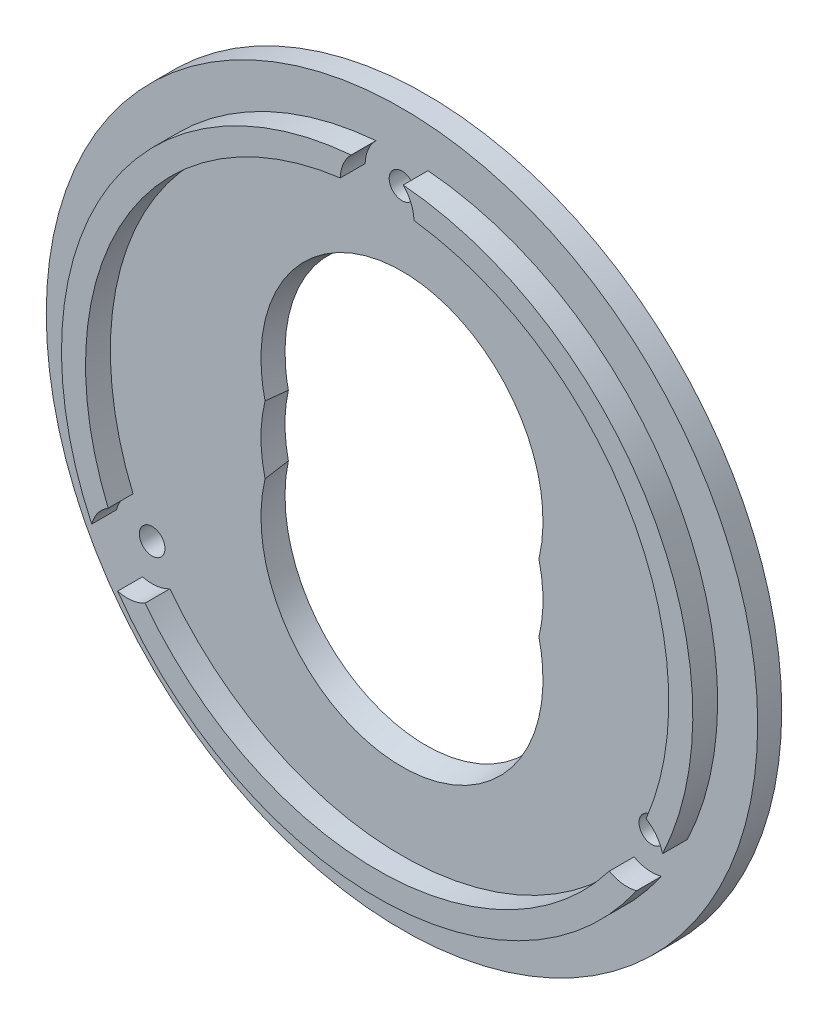
ISO-10303-21;
HEADER;
FILE_DESCRIPTION(('STEP AP214'),'2;1');
FILE_NAME('part.step','',(''),(''),'','','');
FILE_SCHEMA(('AUTOMOTIVE_DESIGN { 1 0 10303 214 1 1 1 1 }'));
ENDSEC;
DATA;
#1=APPLICATION_CONTEXT('core data for automotive mechanical design processes');
#2=APPLICATION_PROTOCOL_DEFINITION('international standard','automotive_design',2000,#1);
#3=PRODUCT_CONTEXT('',#1,'mechanical');
#4=PRODUCT('Part','Part','',(#3));
#5=PRODUCT_RELATED_PRODUCT_CATEGORY('part','',(#4));
#6=PRODUCT_DEFINITION_FORMATION('','',#4);
#7=PRODUCT_DEFINITION_CONTEXT('part definition',#1,'design');
#8=PRODUCT_DEFINITION('design','',#6,#7);
#9=PRODUCT_DEFINITION_SHAPE('','',#8);
#10=(LENGTH_UNIT() NAMED_UNIT(*) SI_UNIT(.MILLI.,.METRE.));
#11=(NAMED_UNIT(*) PLANE_ANGLE_UNIT() SI_UNIT($,.RADIAN.));
#12=(NAMED_UNIT(*) SI_UNIT($,.STERADIAN.) SOLID_ANGLE_UNIT());
#13=UNCERTAINTY_MEASURE_WITH_UNIT(LENGTH_MEASURE(1.E-05),#10,'distance_accuracy_value','');
#14=(GEOMETRIC_REPRESENTATION_CONTEXT(3) GLOBAL_UNCERTAINTY_ASSIGNED_CONTEXT((#13)) GLOBAL_UNIT_ASSIGNED_CONTEXT((#10,
#11,#12)) REPRESENTATION_CONTEXT('',''));
#15=CARTESIAN_POINT('',(0.,0.,0.));
#16=DIRECTION('',(0.,0.,1.));
#17=DIRECTION('',(1.,0.,0.));
#18=AXIS2_PLACEMENT_3D('',#15,#16,#17);
#19=CARTESIAN_POINT('',(0.,0.,6.1));
#20=DIRECTION('',(0.,0.,-1.));
#21=DIRECTION('',(-1.,0.,0.));
#22=AXIS2_PLACEMENT_3D('',#19,#20,#21);
#23=CYLINDRICAL_SURFACE('',#22,17.6);
#24=CARTESIAN_POINT('',(0.,0.,-28.977774788672));
#25=DIRECTION('',(0.,0.99144486137381,-0.130526192220052));
#26=DIRECTION('',(0.,-0.130526192220052,-0.99144486137381));
#27=AXIS2_PLACEMENT_3D('',#24,#25,#26);
#28=ELLIPSE('',#27,134.83883732951,17.6);
#29=CARTESIAN_POINT('',(17.1815541285931,3.81499642545375,0.));
#30=VERTEX_POINT('',#29);
#31=CARTESIAN_POINT('',(17.0890692551262,4.20995391821594,3.));
#32=VERTEX_POINT('',#31);
#33=EDGE_CURVE('E147',#30,#32,#28,.F.);
#34=ORIENTED_EDGE('',*,*,#33,.F.);
#35=CARTESIAN_POINT('',(0.,0.,0.));
#36=DIRECTION('',(0.,0.,1.));
#37=DIRECTION('',(1.,0.,0.));
#38=AXIS2_PLACEMENT_3D('',#35,#36,#37);
#39=CIRCLE('',#38,17.6);
#40=CARTESIAN_POINT('',(17.1815541285931,-3.81499642545375,0.));
#41=VERTEX_POINT('',#40);
#42=EDGE_CURVE('E156',#30,#41,#39,.F.);
#43=ORIENTED_EDGE('',*,*,#42,.T.);
#44=CARTESIAN_POINT('',(0.,0.,-28.977774788672));
#45=DIRECTION('',(0.,-0.99144486137381,-0.130526192220052));
#46=DIRECTION('',(0.,0.130526192220052,-0.99144486137381));
#47=AXIS2_PLACEMENT_3D('',#44,#45,#46);
#48=ELLIPSE('',#47,134.83883732951,17.6);
#49=CARTESIAN_POINT('',(17.0890692551262,-4.20995391821594,3.));
#50=VERTEX_POINT('',#49);
#51=EDGE_CURVE('E43',#41,#50,#48,.T.);
#52=ORIENTED_EDGE('',*,*,#51,.T.);
#53=CARTESIAN_POINT('',(0.,0.,3.));
#54=DIRECTION('',(0.,0.,1.));
#55=DIRECTION('',(1.,0.,0.));
#56=AXIS2_PLACEMENT_3D('',#53,#54,#55);
#57=CIRCLE('',#56,17.6);
#58=EDGE_CURVE('E157',#32,#50,#57,.F.);
#59=ORIENTED_EDGE('',*,*,#58,.F.);
#60=EDGE_LOOP('',(#34,#43,#52,#59));
#61=FACE_BOUND('',#60,.T.);
#62=ADVANCED_FACE('F35',(#61),#23,.F.);
#63=CARTESIAN_POINT('',(-17.0890692551262,4.20995391821594,3.));
#64=VERTEX_POINT('',#63);
#65=CARTESIAN_POINT('',(-17.1815541285931,3.81499642545375,0.));
#66=VERTEX_POINT('',#65);
#67=EDGE_CURVE('E50',#64,#66,#28,.F.);
#68=ORIENTED_EDGE('',*,*,#67,.F.);
#69=CARTESIAN_POINT('',(-17.0890692551262,-4.20995391821594,3.));
#70=VERTEX_POINT('',#69);
#71=EDGE_CURVE('E277',#70,#64,#57,.F.);
#72=ORIENTED_EDGE('',*,*,#71,.F.);
#73=CARTESIAN_POINT('',(-17.1815541285931,-3.81499642545375,0.));
#74=VERTEX_POINT('',#73);
#75=EDGE_CURVE('E170',#70,#74,#48,.T.);
#76=ORIENTED_EDGE('',*,*,#75,.T.);
#77=EDGE_CURVE('E162',#74,#66,#39,.F.);
#78=ORIENTED_EDGE('',*,*,#77,.T.);
#79=EDGE_LOOP('',(#68,#72,#76,#78));
#80=FACE_BOUND('',#79,.T.);
#81=ADVANCED_FACE('F289',(#80),#23,.F.);
#82=CARTESIAN_POINT('',(0.,0.,3.));
#83=DIRECTION('',(0.,0.,1.));
#84=DIRECTION('',(1.,0.,0.));
#85=AXIS2_PLACEMENT_3D('',#82,#83,#84);
#86=PLANE('',#85);
#87=CARTESIAN_POINT('',(0.,8.56841893036899,3.));
#88=DIRECTION('',(0.,0.,1.));
#89=DIRECTION('',(0.,-1.,0.));
#90=AXIS2_PLACEMENT_3D('',#87,#88,#89);
#91=ELLIPSE('',#90,18.2208607752175,17.6);
#92=EDGE_CURVE('E158',#32,#64,#91,.T.);
#93=ORIENTED_EDGE('',*,*,#92,.F.);
#94=ORIENTED_EDGE('',*,*,#58,.T.);
#95=CARTESIAN_POINT('',(0.,-8.56841893036899,3.));
#96=DIRECTION('',(0.,0.,1.));
#97=DIRECTION('',(0.,1.,0.));
#98=AXIS2_PLACEMENT_3D('',#95,#96,#97);
#99=ELLIPSE('',#98,18.2208607752175,17.6);
#100=EDGE_CURVE('E163',#50,#70,#99,.F.);
#101=ORIENTED_EDGE('',*,*,#100,.T.);
#102=ORIENTED_EDGE('',*,*,#71,.T.);
#103=EDGE_LOOP('',(#93,#94,#101,#102));
#104=FACE_BOUND('',#103,.T.);
#105=CARTESIAN_POINT('',(0.,0.,3.));
#106=DIRECTION('',(0.,0.,-1.));
#107=DIRECTION('',(1.,0.,0.));
#108=AXIS2_PLACEMENT_3D('',#105,#106,#107);
#109=CIRCLE('',#108,36.395);
#110=CARTESIAN_POINT('',(28.9669357832984,-22.0343517337421,3.));
#111=VERTEX_POINT('',#110);
#112=CARTESIAN_POINT('',(-28.9669357832984,-22.0343517337421,3.));
#113=VERTEX_POINT('',#112);
#114=EDGE_CURVE('E272',#111,#113,#109,.T.);
#115=ORIENTED_EDGE('',*,*,#114,.F.);
#116=CARTESIAN_POINT('',(31.1769145362398,-18.,3.));
#117=DIRECTION('',(0.,0.,-1.));
#118=DIRECTION('',(1.,0.,0.));
#119=AXIS2_PLACEMENT_3D('',#116,#117,#118);
#120=CIRCLE('',#119,4.60000000000003);
#121=CARTESIAN_POINT('',(32.379109419655,-22.4401269646589,3.));
#122=VERTEX_POINT('',#121);
#123=EDGE_CURVE('E274',#122,#111,#120,.T.);
#124=ORIENTED_EDGE('',*,*,#123,.F.);
#125=CARTESIAN_POINT('',(0.,0.,3.));
#126=DIRECTION('',(0.,0.,1.));
#127=DIRECTION('',(1.,0.,0.));
#128=AXIS2_PLACEMENT_3D('',#125,#126,#127);
#129=CIRCLE('',#128,39.395);
#130=CARTESIAN_POINT('',(-32.379109419655,-22.4401269646588,3.));
#131=VERTEX_POINT('',#130);
#132=EDGE_CURVE('E266',#131,#122,#129,.T.);
#133=ORIENTED_EDGE('',*,*,#132,.F.);
#134=CARTESIAN_POINT('',(-31.1769145362398,-18.,3.));
#135=DIRECTION('',(0.,0.,-1.));
#136=DIRECTION('',(1.,0.,0.));
#137=AXIS2_PLACEMENT_3D('',#134,#135,#136);
#138=CIRCLE('',#137,4.60000000000003);
#139=EDGE_CURVE('E269',#113,#131,#138,.T.);
#140=ORIENTED_EDGE('',*,*,#139,.F.);
#141=EDGE_LOOP('',(#115,#124,#133,#140));
#142=FACE_BOUND('',#141,.T.);
#143=CARTESIAN_POINT('',(31.1769145362398,-18.,3.));
#144=DIRECTION('',(0.,0.,1.));
#145=DIRECTION('',(1.,0.,0.));
#146=AXIS2_PLACEMENT_3D('',#143,#144,#145);
#147=CIRCLE('',#146,1.6);
#148=CARTESIAN_POINT('',(32.7769145362398,-18.,3.));
#149=VERTEX_POINT('',#148);
#150=EDGE_CURVE('E183',#149,#149,#147,.T.);
#151=ORIENTED_EDGE('',*,*,#150,.F.);
#152=EDGE_LOOP('',(#151));
#153=FACE_BOUND('',#152,.T.);
#154=CARTESIAN_POINT('',(0.,0.,3.));
#155=DIRECTION('',(0.,0.,1.));
#156=DIRECTION('',(1.,0.,0.));
#157=AXIS2_PLACEMENT_3D('',#154,#155,#156);
#158=CIRCLE('',#157,44.395);
#159=CARTESIAN_POINT('',(44.395,0.,3.));
#160=VERTEX_POINT('',#159);
#161=EDGE_CURVE('E171',#160,#160,#158,.T.);
#162=ORIENTED_EDGE('',*,*,#161,.T.);
#163=EDGE_LOOP('',(#162));
#164=FACE_BOUND('',#163,.T.);
#165=CARTESIAN_POINT('',(0.,36.,3.));
#166=DIRECTION('',(0.,0.,1.));
#167=DIRECTION('',(1.,0.,0.));
#168=AXIS2_PLACEMENT_3D('',#165,#166,#167);
#169=CIRCLE('',#168,1.6);
#170=CARTESIAN_POINT('',(1.6,36.,3.));
#171=VERTEX_POINT('',#170);
#172=EDGE_CURVE('E178',#171,#171,#169,.T.);
#173=ORIENTED_EDGE('',*,*,#172,.F.);
#174=EDGE_LOOP('',(#173));
#175=FACE_BOUND('',#174,.T.);
#176=CARTESIAN_POINT('',(-31.1769145362398,-18.,3.));
#177=DIRECTION('',(0.,0.,1.));
#178=DIRECTION('',(1.,0.,0.));
#179=AXIS2_PLACEMENT_3D('',#176,#177,#178);
#180=CIRCLE('',#179,1.6);
#181=CARTESIAN_POINT('',(-29.5769145362398,-18.,3.));
#182=VERTEX_POINT('',#181);
#183=EDGE_CURVE('E189',#182,#182,#180,.T.);
#184=ORIENTED_EDGE('',*,*,#183,.F.);
#185=EDGE_LOOP('',(#184));
#186=FACE_BOUND('',#185,.T.);
#187=CARTESIAN_POINT('',(0.,36.,3.));
#188=DIRECTION('',(0.,0.,-1.));
#189=DIRECTION('',(1.,0.,0.));
#190=AXIS2_PLACEMENT_3D('',#187,#188,#189);
#191=CIRCLE('',#190,4.60000000000003);
#192=CARTESIAN_POINT('',(3.24416530571525,39.2611947916667,3.));
#193=VERTEX_POINT('',#192);
#194=CARTESIAN_POINT('',(4.59884046569315,36.103278125,3.));
#195=VERTEX_POINT('',#194);
#196=EDGE_CURVE('E214',#193,#195,#191,.T.);
#197=ORIENTED_EDGE('',*,*,#196,.F.);
#198=CARTESIAN_POINT('',(0.,0.,3.));
#199=DIRECTION('',(0.,0.,1.));
#200=DIRECTION('',(1.,0.,0.));
#201=AXIS2_PLACEMENT_3D('',#198,#199,#200);
#202=CIRCLE('',#201,39.395);
#203=CARTESIAN_POINT('',(35.6232747253702,-16.8210678270078,3.));
#204=VERTEX_POINT('',#203);
#205=EDGE_CURVE('E216',#204,#193,#202,.T.);
#206=ORIENTED_EDGE('',*,*,#205,.F.);
#207=CARTESIAN_POINT('',(31.1769145362398,-18.,3.));
#208=DIRECTION('',(0.,0.,-1.));
#209=DIRECTION('',(1.,0.,0.));
#210=AXIS2_PLACEMENT_3D('',#207,#208,#209);
#211=CIRCLE('',#210,4.60000000000003);
#212=CARTESIAN_POINT('',(33.5657762489916,-14.0689263912579,3.));
#213=VERTEX_POINT('',#212);
#214=EDGE_CURVE('E208',#213,#204,#211,.T.);
#215=ORIENTED_EDGE('',*,*,#214,.F.);
#216=CARTESIAN_POINT('',(0.,0.,3.));
#217=DIRECTION('',(0.,0.,-1.));
#218=DIRECTION('',(1.,0.,0.));
#219=AXIS2_PLACEMENT_3D('',#216,#217,#218);
#220=CIRCLE('',#219,36.395);
#221=EDGE_CURVE('E211',#195,#213,#220,.T.);
#222=ORIENTED_EDGE('',*,*,#221,.F.);
#223=EDGE_LOOP('',(#197,#206,#215,#222));
#224=FACE_BOUND('',#223,.T.);
#225=CARTESIAN_POINT('',(0.,0.,3.));
#226=DIRECTION('',(0.,0.,1.));
#227=DIRECTION('',(1.,0.,0.));
#228=AXIS2_PLACEMENT_3D('',#225,#226,#227);
#229=CIRCLE('',#228,39.395);
#230=CARTESIAN_POINT('',(-3.24416530571525,39.2611947916667,3.));
#231=VERTEX_POINT('',#230);
#232=CARTESIAN_POINT('',(-35.6232747253703,-16.8210678270078,3.));
#233=VERTEX_POINT('',#232);
#234=EDGE_CURVE('E243',#231,#233,#229,.T.);
#235=ORIENTED_EDGE('',*,*,#234,.F.);
#236=CARTESIAN_POINT('',(0.,36.,3.));
#237=DIRECTION('',(0.,0.,-1.));
#238=DIRECTION('',(1.,0.,0.));
#239=AXIS2_PLACEMENT_3D('',#236,#237,#238);
#240=CIRCLE('',#239,4.60000000000003);
#241=CARTESIAN_POINT('',(-4.59884046569315,36.103278125,3.));
#242=VERTEX_POINT('',#241);
#243=EDGE_CURVE('E245',#242,#231,#240,.T.);
#244=ORIENTED_EDGE('',*,*,#243,.F.);
#245=CARTESIAN_POINT('',(0.,0.,3.));
#246=DIRECTION('',(0.,0.,-1.));
#247=DIRECTION('',(1.,0.,0.));
#248=AXIS2_PLACEMENT_3D('',#245,#246,#247);
#249=CIRCLE('',#248,36.395);
#250=CARTESIAN_POINT('',(-33.5657762489916,-14.0689263912579,3.));
#251=VERTEX_POINT('',#250);
#252=EDGE_CURVE('E237',#251,#242,#249,.T.);
#253=ORIENTED_EDGE('',*,*,#252,.F.);
#254=CARTESIAN_POINT('',(-31.1769145362398,-18.,3.));
#255=DIRECTION('',(0.,0.,-1.));
#256=DIRECTION('',(1.,0.,0.));
#257=AXIS2_PLACEMENT_3D('',#254,#255,#256);
#258=CIRCLE('',#257,4.60000000000003);
#259=EDGE_CURVE('E240',#233,#251,#258,.T.);
#260=ORIENTED_EDGE('',*,*,#259,.F.);
#261=EDGE_LOOP('',(#235,#244,#253,#260));
#262=FACE_BOUND('',#261,.T.);
#263=ADVANCED_FACE('F290',(#104,#142,#153,#164,#175,#186,#224,#262),#86,.T.);
#264=CARTESIAN_POINT('',(0.,0.,0.));
#265=DIRECTION('',(0.,0.,1.));
#266=DIRECTION('',(1.,0.,0.));
#267=AXIS2_PLACEMENT_3D('',#264,#265,#266);
#268=PLANE('',#267);
#269=ORIENTED_EDGE('',*,*,#42,.F.);
#270=CARTESIAN_POINT('',(0.,7.76457135307562,0.));
#271=DIRECTION('',(0.,0.,1.));
#272=DIRECTION('',(0.,-1.,0.));
#273=AXIS2_PLACEMENT_3D('',#270,#271,#272);
#274=ELLIPSE('',#273,18.2208607752175,17.6);
#275=EDGE_CURVE('E11',#30,#66,#274,.T.);
#276=ORIENTED_EDGE('',*,*,#275,.T.);
#277=ORIENTED_EDGE('',*,*,#77,.F.);
#278=CARTESIAN_POINT('',(0.,-7.76457135307562,0.));
#279=DIRECTION('',(0.,0.,1.));
#280=DIRECTION('',(0.,1.,0.));
#281=AXIS2_PLACEMENT_3D('',#278,#279,#280);
#282=ELLIPSE('',#281,18.2208607752175,17.6);
#283=EDGE_CURVE('E57',#41,#74,#282,.F.);
#284=ORIENTED_EDGE('',*,*,#283,.F.);
#285=EDGE_LOOP('',(#269,#276,#277,#284));
#286=FACE_BOUND('',#285,.T.);
#287=CARTESIAN_POINT('',(0.,0.,0.));
#288=DIRECTION('',(0.,0.,1.));
#289=DIRECTION('',(1.,0.,0.));
#290=AXIS2_PLACEMENT_3D('',#287,#288,#289);
#291=CIRCLE('',#290,44.395);
#292=CARTESIAN_POINT('',(44.395,0.,0.));
#293=VERTEX_POINT('',#292);
#294=EDGE_CURVE('E168',#293,#293,#291,.T.);
#295=ORIENTED_EDGE('',*,*,#294,.F.);
#296=EDGE_LOOP('',(#295));
#297=FACE_BOUND('',#296,.T.);
#298=CARTESIAN_POINT('',(0.,36.,0.));
#299=DIRECTION('',(0.,0.,1.));
#300=DIRECTION('',(1.,0.,0.));
#301=AXIS2_PLACEMENT_3D('',#298,#299,#300);
#302=CIRCLE('',#301,1.6);
#303=CARTESIAN_POINT('',(1.6,36.,0.));
#304=VERTEX_POINT('',#303);
#305=EDGE_CURVE('E180',#304,#304,#302,.T.);
#306=ORIENTED_EDGE('',*,*,#305,.T.);
#307=EDGE_LOOP('',(#306));
#308=FACE_BOUND('',#307,.T.);
#309=CARTESIAN_POINT('',(31.1769145362398,-18.,0.));
#310=DIRECTION('',(0.,0.,1.));
#311=DIRECTION('',(1.,0.,0.));
#312=AXIS2_PLACEMENT_3D('',#309,#310,#311);
#313=CIRCLE('',#312,1.6);
#314=CARTESIAN_POINT('',(32.7769145362398,-18.,0.));
#315=VERTEX_POINT('',#314);
#316=EDGE_CURVE('E186',#315,#315,#313,.T.);
#317=ORIENTED_EDGE('',*,*,#316,.T.);
#318=EDGE_LOOP('',(#317));
#319=FACE_BOUND('',#318,.T.);
#320=CARTESIAN_POINT('',(-31.1769145362398,-18.,0.));
#321=DIRECTION('',(0.,0.,1.));
#322=DIRECTION('',(1.,0.,0.));
#323=AXIS2_PLACEMENT_3D('',#320,#321,#322);
#324=CIRCLE('',#323,1.6);
#325=CARTESIAN_POINT('',(-29.5769145362398,-18.,0.));
#326=VERTEX_POINT('',#325);
#327=EDGE_CURVE('E192',#326,#326,#324,.T.);
#328=ORIENTED_EDGE('',*,*,#327,.T.);
#329=EDGE_LOOP('',(#328));
#330=FACE_BOUND('',#329,.T.);
#331=ADVANCED_FACE('F160',(#286,#297,#308,#319,#330),#268,.F.);
#332=CARTESIAN_POINT('',(0.,0.,3.));
#333=DIRECTION('',(0.,0.,-1.));
#334=DIRECTION('',(-1.,0.,0.));
#335=AXIS2_PLACEMENT_3D('',#332,#333,#334);
#336=CYLINDRICAL_SURFACE('',#335,44.395);
#337=ORIENTED_EDGE('',*,*,#161,.F.);
#338=EDGE_LOOP('',(#337));
#339=FACE_BOUND('',#338,.T.);
#340=ORIENTED_EDGE('',*,*,#294,.T.);
#341=EDGE_LOOP('',(#340));
#342=FACE_BOUND('',#341,.T.);
#343=ADVANCED_FACE('F37',(#339,#342),#336,.T.);
#344=CARTESIAN_POINT('',(0.,36.,3.));
#345=DIRECTION('',(0.,0.,-1.));
#346=DIRECTION('',(-1.,0.,0.));
#347=AXIS2_PLACEMENT_3D('',#344,#345,#346);
#348=CYLINDRICAL_SURFACE('',#347,1.6);
#349=ORIENTED_EDGE('',*,*,#172,.T.);
#350=EDGE_LOOP('',(#349));
#351=FACE_BOUND('',#350,.T.);
#352=ORIENTED_EDGE('',*,*,#305,.F.);
#353=EDGE_LOOP('',(#352));
#354=FACE_BOUND('',#353,.T.);
#355=ADVANCED_FACE('F375',(#351,#354),#348,.F.);
#356=CARTESIAN_POINT('',(31.1769145362398,-18.,3.));
#357=DIRECTION('',(0.,0.,-1.));
#358=DIRECTION('',(-1.,0.,0.));
#359=AXIS2_PLACEMENT_3D('',#356,#357,#358);
#360=CYLINDRICAL_SURFACE('',#359,1.6);
#361=ORIENTED_EDGE('',*,*,#150,.T.);
#362=EDGE_LOOP('',(#361));
#363=FACE_BOUND('',#362,.T.);
#364=ORIENTED_EDGE('',*,*,#316,.F.);
#365=EDGE_LOOP('',(#364));
#366=FACE_BOUND('',#365,.T.);
#367=ADVANCED_FACE('F371',(#363,#366),#360,.F.);
#368=CARTESIAN_POINT('',(-31.1769145362398,-18.,3.));
#369=DIRECTION('',(0.,0.,-1.));
#370=DIRECTION('',(-1.,0.,0.));
#371=AXIS2_PLACEMENT_3D('',#368,#369,#370);
#372=CYLINDRICAL_SURFACE('',#371,1.6);
#373=ORIENTED_EDGE('',*,*,#183,.T.);
#374=EDGE_LOOP('',(#373));
#375=FACE_BOUND('',#374,.T.);
#376=ORIENTED_EDGE('',*,*,#327,.F.);
#377=EDGE_LOOP('',(#376));
#378=FACE_BOUND('',#377,.T.);
#379=ADVANCED_FACE('F367',(#375,#378),#372,.F.);
#380=CARTESIAN_POINT('',(0.,0.,6.1));
#381=DIRECTION('',(0.,0.,-1.));
#382=DIRECTION('',(-1.,0.,0.));
#383=AXIS2_PLACEMENT_3D('',#380,#381,#382);
#384=CYLINDRICAL_SURFACE('',#383,39.395);
#385=ORIENTED_EDGE('',*,*,#205,.T.);
#386=DIRECTION('',(0.,0.,-1.));
#387=VECTOR('',#386,1.);
#388=CARTESIAN_POINT('',(3.24416530571525,39.2611947916667,6.1));
#389=LINE('',#388,#387);
#390=CARTESIAN_POINT('',(3.24416530571525,39.2611947916667,6.1));
#391=VERTEX_POINT('',#390);
#392=EDGE_CURVE('E195',#391,#193,#389,.T.);
#393=ORIENTED_EDGE('',*,*,#392,.F.);
#394=CARTESIAN_POINT('',(0.,0.,6.1));
#395=DIRECTION('',(0.,0.,1.));
#396=DIRECTION('',(1.,0.,0.));
#397=AXIS2_PLACEMENT_3D('',#394,#395,#396);
#398=CIRCLE('',#397,39.395);
#399=CARTESIAN_POINT('',(35.6232747253702,-16.8210678270078,6.1));
#400=VERTEX_POINT('',#399);
#401=EDGE_CURVE('E210',#400,#391,#398,.T.);
#402=ORIENTED_EDGE('',*,*,#401,.F.);
#403=DIRECTION('',(0.,0.,-1.));
#404=VECTOR('',#403,1.);
#405=CARTESIAN_POINT('',(35.6232747253702,-16.8210678270078,6.1));
#406=LINE('',#405,#404);
#407=EDGE_CURVE('E204',#400,#204,#406,.T.);
#408=ORIENTED_EDGE('',*,*,#407,.T.);
#409=EDGE_LOOP('',(#385,#393,#402,#408));
#410=FACE_BOUND('',#409,.T.);
#411=ADVANCED_FACE('F363',(#410),#384,.T.);
#412=CARTESIAN_POINT('',(0.,36.,6.1));
#413=DIRECTION('',(0.,0.,-1.));
#414=DIRECTION('',(-1.,0.,0.));
#415=AXIS2_PLACEMENT_3D('',#412,#413,#414);
#416=CYLINDRICAL_SURFACE('',#415,4.60000000000003);
#417=ORIENTED_EDGE('',*,*,#196,.T.);
#418=DIRECTION('',(0.,0.,-1.));
#419=VECTOR('',#418,1.);
#420=CARTESIAN_POINT('',(4.59884046569315,36.103278125,6.1));
#421=LINE('',#420,#419);
#422=CARTESIAN_POINT('',(4.59884046569315,36.103278125,6.1));
#423=VERTEX_POINT('',#422);
#424=EDGE_CURVE('E199',#423,#195,#421,.T.);
#425=ORIENTED_EDGE('',*,*,#424,.F.);
#426=CARTESIAN_POINT('',(0.,36.,6.1));
#427=DIRECTION('',(0.,0.,-1.));
#428=DIRECTION('',(1.,0.,0.));
#429=AXIS2_PLACEMENT_3D('',#426,#427,#428);
#430=CIRCLE('',#429,4.60000000000003);
#431=EDGE_CURVE('E223',#391,#423,#430,.T.);
#432=ORIENTED_EDGE('',*,*,#431,.F.);
#433=ORIENTED_EDGE('',*,*,#392,.T.);
#434=EDGE_LOOP('',(#417,#425,#432,#433));
#435=FACE_BOUND('',#434,.T.);
#436=ADVANCED_FACE('F359',(#435),#416,.F.);
#437=CARTESIAN_POINT('',(0.,0.,6.1));
#438=DIRECTION('',(0.,0.,-1.));
#439=DIRECTION('',(-1.,0.,0.));
#440=AXIS2_PLACEMENT_3D('',#437,#438,#439);
#441=CYLINDRICAL_SURFACE('',#440,36.395);
#442=ORIENTED_EDGE('',*,*,#221,.T.);
#443=DIRECTION('',(0.,0.,-1.));
#444=VECTOR('',#443,1.);
#445=CARTESIAN_POINT('',(33.5657762489916,-14.0689263912579,6.1));
#446=LINE('',#445,#444);
#447=CARTESIAN_POINT('',(33.5657762489916,-14.0689263912579,6.1));
#448=VERTEX_POINT('',#447);
#449=EDGE_CURVE('E202',#448,#213,#446,.T.);
#450=ORIENTED_EDGE('',*,*,#449,.F.);
#451=CARTESIAN_POINT('',(0.,0.,6.1));
#452=DIRECTION('',(0.,0.,-1.));
#453=DIRECTION('',(1.,0.,0.));
#454=AXIS2_PLACEMENT_3D('',#451,#452,#453);
#455=CIRCLE('',#454,36.395);
#456=EDGE_CURVE('E221',#423,#448,#455,.T.);
#457=ORIENTED_EDGE('',*,*,#456,.F.);
#458=ORIENTED_EDGE('',*,*,#424,.T.);
#459=EDGE_LOOP('',(#442,#450,#457,#458));
#460=FACE_BOUND('',#459,.T.);
#461=ADVANCED_FACE('F355',(#460),#441,.F.);
#462=CARTESIAN_POINT('',(31.1769145362398,-18.,6.1));
#463=DIRECTION('',(0.,0.,-1.));
#464=DIRECTION('',(-1.,0.,0.));
#465=AXIS2_PLACEMENT_3D('',#462,#463,#464);
#466=CYLINDRICAL_SURFACE('',#465,4.60000000000003);
#467=ORIENTED_EDGE('',*,*,#214,.T.);
#468=ORIENTED_EDGE('',*,*,#407,.F.);
#469=CARTESIAN_POINT('',(31.1769145362398,-18.,6.1));
#470=DIRECTION('',(0.,0.,-1.));
#471=DIRECTION('',(1.,0.,0.));
#472=AXIS2_PLACEMENT_3D('',#469,#470,#471);
#473=CIRCLE('',#472,4.60000000000003);
#474=EDGE_CURVE('E207',#448,#400,#473,.T.);
#475=ORIENTED_EDGE('',*,*,#474,.F.);
#476=ORIENTED_EDGE('',*,*,#449,.T.);
#477=EDGE_LOOP('',(#467,#468,#475,#476));
#478=FACE_BOUND('',#477,.T.);
#479=ADVANCED_FACE('F351',(#478),#466,.F.);
#480=CARTESIAN_POINT('',(0.,18.,6.1));
#481=DIRECTION('',(0.,0.,1.));
#482=DIRECTION('',(1.,0.,0.));
#483=AXIS2_PLACEMENT_3D('',#480,#481,#482);
#484=PLANE('',#483);
#485=ORIENTED_EDGE('',*,*,#401,.T.);
#486=ORIENTED_EDGE('',*,*,#431,.T.);
#487=ORIENTED_EDGE('',*,*,#456,.T.);
#488=ORIENTED_EDGE('',*,*,#474,.T.);
#489=EDGE_LOOP('',(#485,#486,#487,#488));
#490=FACE_BOUND('',#489,.T.);
#491=ADVANCED_FACE('F347',(#490),#484,.T.);
#492=CARTESIAN_POINT('',(0.,36.,6.1));
#493=DIRECTION('',(0.,0.,-1.));
#494=DIRECTION('',(-1.,0.,0.));
#495=AXIS2_PLACEMENT_3D('',#492,#493,#494);
#496=CYLINDRICAL_SURFACE('',#495,4.60000000000003);
#497=ORIENTED_EDGE('',*,*,#243,.T.);
#498=DIRECTION('',(0.,0.,-1.));
#499=VECTOR('',#498,1.);
#500=CARTESIAN_POINT('',(-3.24416530571525,39.2611947916667,6.1));
#501=LINE('',#500,#499);
#502=CARTESIAN_POINT('',(-3.24416530571525,39.2611947916667,6.1));
#503=VERTEX_POINT('',#502);
#504=EDGE_CURVE('E219',#503,#231,#501,.T.);
#505=ORIENTED_EDGE('',*,*,#504,.F.);
#506=CARTESIAN_POINT('',(0.,36.,6.1));
#507=DIRECTION('',(0.,0.,-1.));
#508=DIRECTION('',(1.,0.,0.));
#509=AXIS2_PLACEMENT_3D('',#506,#507,#508);
#510=CIRCLE('',#509,4.60000000000003);
#511=CARTESIAN_POINT('',(-4.59884046569315,36.103278125,6.1));
#512=VERTEX_POINT('',#511);
#513=EDGE_CURVE('E239',#512,#503,#510,.T.);
#514=ORIENTED_EDGE('',*,*,#513,.F.);
#515=DIRECTION('',(0.,0.,-1.));
#516=VECTOR('',#515,1.);
#517=CARTESIAN_POINT('',(-4.59884046569315,36.103278125,6.1));
#518=LINE('',#517,#516);
#519=EDGE_CURVE('E233',#512,#242,#518,.T.);
#520=ORIENTED_EDGE('',*,*,#519,.T.);
#521=EDGE_LOOP('',(#497,#505,#514,#520));
#522=FACE_BOUND('',#521,.T.);
#523=ADVANCED_FACE('F343',(#522),#496,.F.);
#524=CARTESIAN_POINT('',(0.,0.,6.1));
#525=DIRECTION('',(0.,0.,-1.));
#526=DIRECTION('',(-1.,0.,0.));
#527=AXIS2_PLACEMENT_3D('',#524,#525,#526);
#528=CYLINDRICAL_SURFACE('',#527,39.395);
#529=ORIENTED_EDGE('',*,*,#234,.T.);
#530=DIRECTION('',(0.,0.,-1.));
#531=VECTOR('',#530,1.);
#532=CARTESIAN_POINT('',(-35.6232747253703,-16.8210678270078,6.1));
#533=LINE('',#532,#531);
#534=CARTESIAN_POINT('',(-35.6232747253703,-16.8210678270078,6.1));
#535=VERTEX_POINT('',#534);
#536=EDGE_CURVE('E228',#535,#233,#533,.T.);
#537=ORIENTED_EDGE('',*,*,#536,.F.);
#538=CARTESIAN_POINT('',(0.,0.,6.1));
#539=DIRECTION('',(0.,0.,1.));
#540=DIRECTION('',(1.,0.,0.));
#541=AXIS2_PLACEMENT_3D('',#538,#539,#540);
#542=CIRCLE('',#541,39.395);
#543=EDGE_CURVE('E252',#503,#535,#542,.T.);
#544=ORIENTED_EDGE('',*,*,#543,.F.);
#545=ORIENTED_EDGE('',*,*,#504,.T.);
#546=EDGE_LOOP('',(#529,#537,#544,#545));
#547=FACE_BOUND('',#546,.T.);
#548=ADVANCED_FACE('F339',(#547),#528,.T.);
#549=CARTESIAN_POINT('',(-31.1769145362398,-18.,6.1));
#550=DIRECTION('',(0.,0.,-1.));
#551=DIRECTION('',(-1.,0.,0.));
#552=AXIS2_PLACEMENT_3D('',#549,#550,#551);
#553=CYLINDRICAL_SURFACE('',#552,4.60000000000003);
#554=ORIENTED_EDGE('',*,*,#259,.T.);
#555=DIRECTION('',(0.,0.,-1.));
#556=VECTOR('',#555,1.);
#557=CARTESIAN_POINT('',(-33.5657762489916,-14.0689263912579,6.1));
#558=LINE('',#557,#556);
#559=CARTESIAN_POINT('',(-33.5657762489916,-14.0689263912579,6.1));
#560=VERTEX_POINT('',#559);
#561=EDGE_CURVE('E231',#560,#251,#558,.T.);
#562=ORIENTED_EDGE('',*,*,#561,.F.);
#563=CARTESIAN_POINT('',(-31.1769145362398,-18.,6.1));
#564=DIRECTION('',(0.,0.,-1.));
#565=DIRECTION('',(1.,0.,0.));
#566=AXIS2_PLACEMENT_3D('',#563,#564,#565);
#567=CIRCLE('',#566,4.60000000000003);
#568=EDGE_CURVE('E250',#535,#560,#567,.T.);
#569=ORIENTED_EDGE('',*,*,#568,.F.);
#570=ORIENTED_EDGE('',*,*,#536,.T.);
#571=EDGE_LOOP('',(#554,#562,#569,#570));
#572=FACE_BOUND('',#571,.T.);
#573=ADVANCED_FACE('F335',(#572),#553,.F.);
#574=CARTESIAN_POINT('',(0.,0.,6.1));
#575=DIRECTION('',(0.,0.,-1.));
#576=DIRECTION('',(-1.,0.,0.));
#577=AXIS2_PLACEMENT_3D('',#574,#575,#576);
#578=CYLINDRICAL_SURFACE('',#577,36.395);
#579=ORIENTED_EDGE('',*,*,#252,.T.);
#580=ORIENTED_EDGE('',*,*,#519,.F.);
#581=CARTESIAN_POINT('',(0.,0.,6.1));
#582=DIRECTION('',(0.,0.,-1.));
#583=DIRECTION('',(1.,0.,0.));
#584=AXIS2_PLACEMENT_3D('',#581,#582,#583);
#585=CIRCLE('',#584,36.395);
#586=EDGE_CURVE('E236',#560,#512,#585,.T.);
#587=ORIENTED_EDGE('',*,*,#586,.F.);
#588=ORIENTED_EDGE('',*,*,#561,.T.);
#589=EDGE_LOOP('',(#579,#580,#587,#588));
#590=FACE_BOUND('',#589,.T.);
#591=ADVANCED_FACE('F331',(#590),#578,.F.);
#592=CARTESIAN_POINT('',(0.,18.,6.1));
#593=DIRECTION('',(0.,0.,1.));
#594=DIRECTION('',(1.,0.,0.));
#595=AXIS2_PLACEMENT_3D('',#592,#593,#594);
#596=PLANE('',#595);
#597=ORIENTED_EDGE('',*,*,#513,.T.);
#598=ORIENTED_EDGE('',*,*,#543,.T.);
#599=ORIENTED_EDGE('',*,*,#568,.T.);
#600=ORIENTED_EDGE('',*,*,#586,.T.);
#601=EDGE_LOOP('',(#597,#598,#599,#600));
#602=FACE_BOUND('',#601,.T.);
#603=ADVANCED_FACE('F327',(#602),#596,.T.);
#604=CARTESIAN_POINT('',(31.1769145362398,-18.,6.1));
#605=DIRECTION('',(0.,0.,-1.));
#606=DIRECTION('',(-1.,0.,0.));
#607=AXIS2_PLACEMENT_3D('',#604,#605,#606);
#608=CYLINDRICAL_SURFACE('',#607,4.60000000000003);
#609=ORIENTED_EDGE('',*,*,#123,.T.);
#610=DIRECTION('',(0.,0.,-1.));
#611=VECTOR('',#610,1.);
#612=CARTESIAN_POINT('',(28.9669357832984,-22.0343517337421,6.1));
#613=LINE('',#612,#611);
#614=CARTESIAN_POINT('',(28.9669357832984,-22.0343517337421,6.1));
#615=VERTEX_POINT('',#614);
#616=EDGE_CURVE('E248',#615,#111,#613,.T.);
#617=ORIENTED_EDGE('',*,*,#616,.F.);
#618=CARTESIAN_POINT('',(31.1769145362398,-18.,6.1));
#619=DIRECTION('',(0.,0.,-1.));
#620=DIRECTION('',(1.,0.,0.));
#621=AXIS2_PLACEMENT_3D('',#618,#619,#620);
#622=CIRCLE('',#621,4.60000000000003);
#623=CARTESIAN_POINT('',(32.379109419655,-22.4401269646589,6.1));
#624=VERTEX_POINT('',#623);
#625=EDGE_CURVE('E268',#624,#615,#622,.T.);
#626=ORIENTED_EDGE('',*,*,#625,.F.);
#627=DIRECTION('',(0.,0.,-1.));
#628=VECTOR('',#627,1.);
#629=CARTESIAN_POINT('',(32.379109419655,-22.4401269646589,6.1));
#630=LINE('',#629,#628);
#631=EDGE_CURVE('E262',#624,#122,#630,.T.);
#632=ORIENTED_EDGE('',*,*,#631,.T.);
#633=EDGE_LOOP('',(#609,#617,#626,#632));
#634=FACE_BOUND('',#633,.T.);
#635=ADVANCED_FACE('F323',(#634),#608,.F.);
#636=CARTESIAN_POINT('',(0.,0.,6.1));
#637=DIRECTION('',(0.,0.,-1.));
#638=DIRECTION('',(-1.,0.,0.));
#639=AXIS2_PLACEMENT_3D('',#636,#637,#638);
#640=CYLINDRICAL_SURFACE('',#639,36.395);
#641=ORIENTED_EDGE('',*,*,#114,.T.);
#642=DIRECTION('',(0.,0.,-1.));
#643=VECTOR('',#642,1.);
#644=CARTESIAN_POINT('',(-28.9669357832984,-22.0343517337421,6.1));
#645=LINE('',#644,#643);
#646=CARTESIAN_POINT('',(-28.9669357832984,-22.0343517337421,6.1));
#647=VERTEX_POINT('',#646);
#648=EDGE_CURVE('E257',#647,#113,#645,.T.);
#649=ORIENTED_EDGE('',*,*,#648,.F.);
#650=CARTESIAN_POINT('',(0.,0.,6.1));
#651=DIRECTION('',(0.,0.,-1.));
#652=DIRECTION('',(1.,0.,0.));
#653=AXIS2_PLACEMENT_3D('',#650,#651,#652);
#654=CIRCLE('',#653,36.395);
#655=EDGE_CURVE('E281',#615,#647,#654,.T.);
#656=ORIENTED_EDGE('',*,*,#655,.F.);
#657=ORIENTED_EDGE('',*,*,#616,.T.);
#658=EDGE_LOOP('',(#641,#649,#656,#657));
#659=FACE_BOUND('',#658,.T.);
#660=ADVANCED_FACE('F319',(#659),#640,.F.);
#661=CARTESIAN_POINT('',(-31.1769145362398,-18.,6.1));
#662=DIRECTION('',(0.,0.,-1.));
#663=DIRECTION('',(-1.,0.,0.));
#664=AXIS2_PLACEMENT_3D('',#661,#662,#663);
#665=CYLINDRICAL_SURFACE('',#664,4.60000000000003);
#666=ORIENTED_EDGE('',*,*,#139,.T.);
#667=DIRECTION('',(0.,0.,-1.));
#668=VECTOR('',#667,1.);
#669=CARTESIAN_POINT('',(-32.379109419655,-22.4401269646588,6.1));
#670=LINE('',#669,#668);
#671=CARTESIAN_POINT('',(-32.379109419655,-22.4401269646588,6.1));
#672=VERTEX_POINT('',#671);
#673=EDGE_CURVE('E260',#672,#131,#670,.T.);
#674=ORIENTED_EDGE('',*,*,#673,.F.);
#675=CARTESIAN_POINT('',(-31.1769145362398,-18.,6.1));
#676=DIRECTION('',(0.,0.,-1.));
#677=DIRECTION('',(1.,0.,0.));
#678=AXIS2_PLACEMENT_3D('',#675,#676,#677);
#679=CIRCLE('',#678,4.60000000000003);
#680=EDGE_CURVE('E279',#647,#672,#679,.T.);
#681=ORIENTED_EDGE('',*,*,#680,.F.);
#682=ORIENTED_EDGE('',*,*,#648,.T.);
#683=EDGE_LOOP('',(#666,#674,#681,#682));
#684=FACE_BOUND('',#683,.T.);
#685=ADVANCED_FACE('F315',(#684),#665,.F.);
#686=CARTESIAN_POINT('',(0.,0.,6.1));
#687=DIRECTION('',(0.,0.,-1.));
#688=DIRECTION('',(-1.,0.,0.));
#689=AXIS2_PLACEMENT_3D('',#686,#687,#688);
#690=CYLINDRICAL_SURFACE('',#689,39.395);
#691=ORIENTED_EDGE('',*,*,#132,.T.);
#692=ORIENTED_EDGE('',*,*,#631,.F.);
#693=CARTESIAN_POINT('',(0.,0.,6.1));
#694=DIRECTION('',(0.,0.,1.));
#695=DIRECTION('',(1.,0.,0.));
#696=AXIS2_PLACEMENT_3D('',#693,#694,#695);
#697=CIRCLE('',#696,39.395);
#698=EDGE_CURVE('E265',#672,#624,#697,.T.);
#699=ORIENTED_EDGE('',*,*,#698,.F.);
#700=ORIENTED_EDGE('',*,*,#673,.T.);
#701=EDGE_LOOP('',(#691,#692,#699,#700));
#702=FACE_BOUND('',#701,.T.);
#703=ADVANCED_FACE('F304',(#702),#690,.T.);
#704=CARTESIAN_POINT('',(15.5884572681199,-9.,6.1));
#705=DIRECTION('',(0.,0.,1.));
#706=DIRECTION('',(1.,0.,0.));
#707=AXIS2_PLACEMENT_3D('',#704,#705,#706);
#708=PLANE('',#707);
#709=ORIENTED_EDGE('',*,*,#625,.T.);
#710=ORIENTED_EDGE('',*,*,#655,.T.);
#711=ORIENTED_EDGE('',*,*,#680,.T.);
#712=ORIENTED_EDGE('',*,*,#698,.T.);
#713=EDGE_LOOP('',(#709,#710,#711,#712));
#714=FACE_BOUND('',#713,.T.);
#715=ADVANCED_FACE('F295',(#714),#708,.T.);
#716=CARTESIAN_POINT('',(0.,-11.7433447966629,14.8489846432737));
#717=DIRECTION('',(0.,0.258819045102521,-0.965925826289068));
#718=DIRECTION('',(0.,0.965925826289068,0.258819045102521));
#719=AXIS2_PLACEMENT_3D('',#716,#717,#718);
#720=CYLINDRICAL_SURFACE('',#719,17.6);
#721=ORIENTED_EDGE('',*,*,#283,.T.);
#722=ORIENTED_EDGE('',*,*,#75,.F.);
#723=ORIENTED_EDGE('',*,*,#100,.F.);
#724=ORIENTED_EDGE('',*,*,#51,.F.);
#725=EDGE_LOOP('',(#721,#722,#723,#724));
#726=FACE_BOUND('',#725,.T.);
#727=ADVANCED_FACE('F293',(#726),#720,.F.);
#728=CARTESIAN_POINT('',(0.,11.7433447966629,14.8489846432737));
#729=DIRECTION('',(0.,-0.258819045102521,-0.965925826289068));
#730=DIRECTION('',(0.,0.965925826289068,-0.258819045102521));
#731=AXIS2_PLACEMENT_3D('',#728,#729,#730);
#732=CYLINDRICAL_SURFACE('',#731,17.6);
#733=ORIENTED_EDGE('',*,*,#92,.T.);
#734=ORIENTED_EDGE('',*,*,#67,.T.);
#735=ORIENTED_EDGE('',*,*,#275,.F.);
#736=ORIENTED_EDGE('',*,*,#33,.T.);
#737=EDGE_LOOP('',(#733,#734,#735,#736));
#738=FACE_BOUND('',#737,.T.);
#739=ADVANCED_FACE('F146',(#738),#732,.F.);
#740=CLOSED_SHELL('',(#62,#81,#263,#331,#343,#355,#367,#379,#411,#436,#461,#479,#491,#523,#548,
#573,#591,#603,#635,#660,#685,#703,#715,#727,#739));
#741=MANIFOLD_SOLID_BREP('B2',#740);
#742=ADVANCED_BREP_SHAPE_REPRESENTATION('',(#18,#741),#14);
#743=SHAPE_DEFINITION_REPRESENTATION(#9,#742);
ENDSEC;
END-ISO-10303-21;
